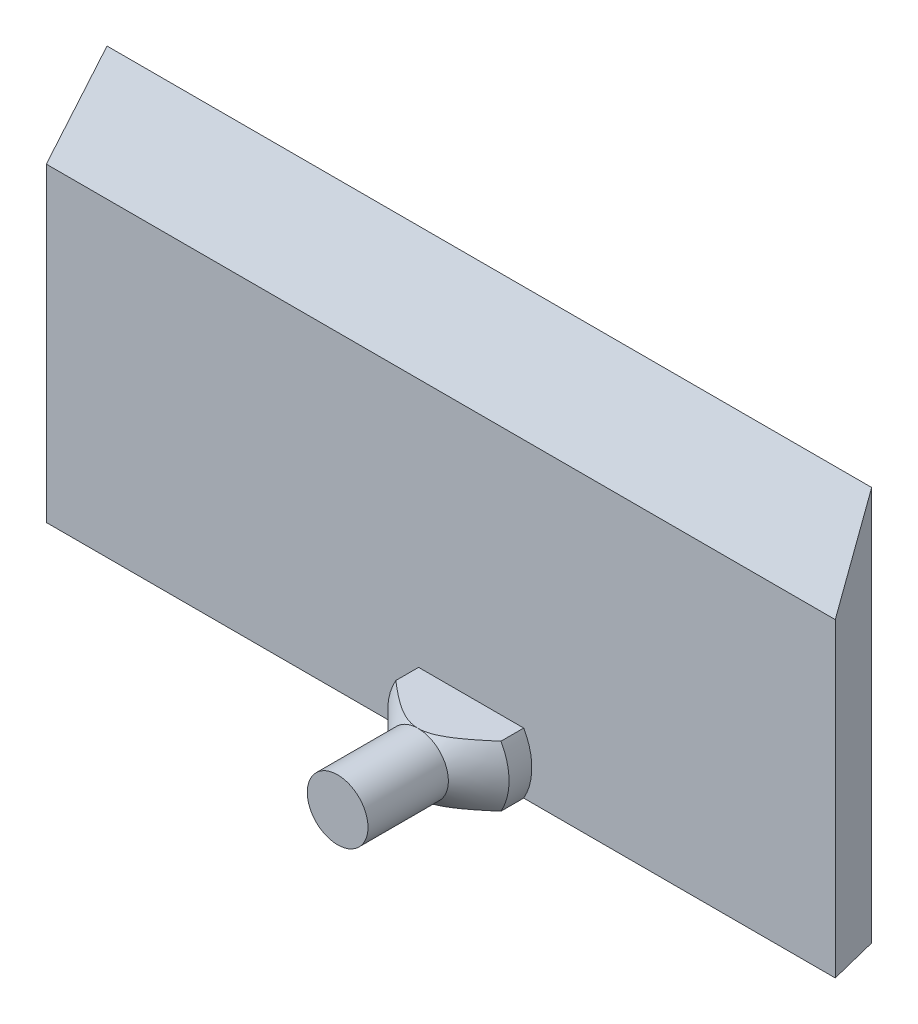
ISO-10303-21;
HEADER;
FILE_DESCRIPTION(('STEP AP214'),'2;1');
FILE_NAME('part.step','',(''),(''),'','','');
FILE_SCHEMA(('AUTOMOTIVE_DESIGN { 1 0 10303 214 1 1 1 1 }'));
ENDSEC;
DATA;
#1=APPLICATION_CONTEXT('core data for automotive mechanical design processes');
#2=APPLICATION_PROTOCOL_DEFINITION('international standard','automotive_design',2000,#1);
#3=PRODUCT_CONTEXT('',#1,'mechanical');
#4=PRODUCT('Part','Part','',(#3));
#5=PRODUCT_RELATED_PRODUCT_CATEGORY('part','',(#4));
#6=PRODUCT_DEFINITION_FORMATION('','',#4);
#7=PRODUCT_DEFINITION_CONTEXT('part definition',#1,'design');
#8=PRODUCT_DEFINITION('design','',#6,#7);
#9=PRODUCT_DEFINITION_SHAPE('','',#8);
#10=(LENGTH_UNIT() NAMED_UNIT(*) SI_UNIT(.MILLI.,.METRE.));
#11=(NAMED_UNIT(*) PLANE_ANGLE_UNIT() SI_UNIT($,.RADIAN.));
#12=(NAMED_UNIT(*) SI_UNIT($,.STERADIAN.) SOLID_ANGLE_UNIT());
#13=UNCERTAINTY_MEASURE_WITH_UNIT(LENGTH_MEASURE(1.E-05),#10,'distance_accuracy_value','');
#14=(GEOMETRIC_REPRESENTATION_CONTEXT(3) GLOBAL_UNCERTAINTY_ASSIGNED_CONTEXT((#13)) GLOBAL_UNIT_ASSIGNED_CONTEXT((#10,
#11,#12)) REPRESENTATION_CONTEXT('',''));
#15=CARTESIAN_POINT('',(0.,0.,0.));
#16=DIRECTION('',(0.,0.,1.));
#17=DIRECTION('',(1.,0.,0.));
#18=AXIS2_PLACEMENT_3D('',#15,#16,#17);
#19=CARTESIAN_POINT('',(0.,0.,1.6));
#20=DIRECTION('',(0.,0.,1.));
#21=DIRECTION('',(1.,0.,0.));
#22=AXIS2_PLACEMENT_3D('',#19,#20,#21);
#23=PLANE('',#22);
#24=DIRECTION('',(0.,-1.,0.));
#25=VECTOR('',#24,1.);
#26=CARTESIAN_POINT('',(13.,0.,1.6));
#27=LINE('',#26,#25);
#28=CARTESIAN_POINT('',(13.,3.7287187078898,1.6));
#29=VERTEX_POINT('',#28);
#30=CARTESIAN_POINT('',(13.,-6.5,1.6));
#31=VERTEX_POINT('',#30);
#32=EDGE_CURVE('E187',#29,#31,#27,.T.);
#33=ORIENTED_EDGE('',*,*,#32,.F.);
#34=DIRECTION('',(-1.,0.,0.));
#35=VECTOR('',#34,1.);
#36=CARTESIAN_POINT('',(0.,3.7287187078898,1.6));
#37=LINE('',#36,#35);
#38=CARTESIAN_POINT('',(-13.,3.7287187078898,1.6));
#39=VERTEX_POINT('',#38);
#40=EDGE_CURVE('E67',#29,#39,#37,.T.);
#41=ORIENTED_EDGE('',*,*,#40,.T.);
#42=DIRECTION('',(0.,-1.,0.));
#43=VECTOR('',#42,1.);
#44=CARTESIAN_POINT('',(-13.,0.,1.6));
#45=LINE('',#44,#43);
#46=CARTESIAN_POINT('',(-13.,-6.5,1.6));
#47=VERTEX_POINT('',#46);
#48=EDGE_CURVE('E180',#39,#47,#45,.T.);
#49=ORIENTED_EDGE('',*,*,#48,.T.);
#50=DIRECTION('',(1.,0.,0.));
#51=VECTOR('',#50,1.);
#52=CARTESIAN_POINT('',(0.,-6.5,1.6));
#53=LINE('',#52,#51);
#54=CARTESIAN_POINT('',(-0.732050807568877,-6.5,1.6));
#55=VERTEX_POINT('',#54);
#56=EDGE_CURVE('E184',#47,#55,#53,.T.);
#57=ORIENTED_EDGE('',*,*,#56,.T.);
#58=CARTESIAN_POINT('',(1.,-5.5,1.6));
#59=DIRECTION('',(0.,0.,1.));
#60=DIRECTION('',(1.,0.,0.));
#61=AXIS2_PLACEMENT_3D('',#58,#59,#60);
#62=CIRCLE('',#61,2.);
#63=CARTESIAN_POINT('',(-0.732050807568877,-4.5,1.6));
#64=VERTEX_POINT('',#63);
#65=EDGE_CURVE('E173',#55,#64,#62,.F.);
#66=ORIENTED_EDGE('',*,*,#65,.T.);
#67=DIRECTION('',(-1.,0.,0.));
#68=VECTOR('',#67,1.);
#69=CARTESIAN_POINT('',(0.,-4.5,1.6));
#70=LINE('',#69,#68);
#71=CARTESIAN_POINT('',(2.73205080756888,-4.5,1.6));
#72=VERTEX_POINT('',#71);
#73=EDGE_CURVE('E170',#72,#64,#70,.T.);
#74=ORIENTED_EDGE('',*,*,#73,.F.);
#75=CARTESIAN_POINT('',(1.,-5.5,1.6));
#76=DIRECTION('',(0.,0.,1.));
#77=DIRECTION('',(1.,0.,0.));
#78=AXIS2_PLACEMENT_3D('',#75,#76,#77);
#79=CIRCLE('',#78,2.);
#80=CARTESIAN_POINT('',(2.73205080756888,-6.5,1.6));
#81=VERTEX_POINT('',#80);
#82=EDGE_CURVE('E155',#72,#81,#79,.F.);
#83=ORIENTED_EDGE('',*,*,#82,.T.);
#84=EDGE_CURVE('E182',#81,#31,#53,.T.);
#85=ORIENTED_EDGE('',*,*,#84,.T.);
#86=EDGE_LOOP('',(#33,#41,#49,#57,#66,#74,#83,#85));
#87=FACE_BOUND('',#86,.T.);
#88=ADVANCED_FACE('F59',(#87),#23,.T.);
#89=CARTESIAN_POINT('',(1.,-5.5,6.));
#90=DIRECTION('',(0.,0.,-1.));
#91=DIRECTION('',(-1.,0.,0.));
#92=AXIS2_PLACEMENT_3D('',#89,#90,#91);
#93=CYLINDRICAL_SURFACE('',#92,1.);
#94=CARTESIAN_POINT('',(1.,-5.5,6.));
#95=DIRECTION('',(0.,0.,1.));
#96=DIRECTION('',(1.,0.,0.));
#97=AXIS2_PLACEMENT_3D('',#94,#95,#96);
#98=CIRCLE('',#97,1.);
#99=CARTESIAN_POINT('',(2.,-5.5,6.));
#100=VERTEX_POINT('',#99);
#101=EDGE_CURVE('E176',#100,#100,#98,.T.);
#102=ORIENTED_EDGE('',*,*,#101,.F.);
#103=EDGE_LOOP('',(#102));
#104=FACE_BOUND('',#103,.T.);
#105=CARTESIAN_POINT('',(1.,-5.5,3.35));
#106=DIRECTION('',(0.,0.,1.));
#107=DIRECTION('',(1.,0.,0.));
#108=AXIS2_PLACEMENT_3D('',#105,#106,#107);
#109=CIRCLE('',#108,1.);
#110=CARTESIAN_POINT('',(1.,-4.5,3.35));
#111=VERTEX_POINT('',#110);
#112=CARTESIAN_POINT('',(1.,-6.5,3.35));
#113=VERTEX_POINT('',#112);
#114=EDGE_CURVE('E133',#111,#113,#109,.T.);
#115=ORIENTED_EDGE('',*,*,#114,.T.);
#116=CARTESIAN_POINT('',(1.,-5.5,3.35));
#117=DIRECTION('',(0.,0.,1.));
#118=DIRECTION('',(1.,0.,0.));
#119=AXIS2_PLACEMENT_3D('',#116,#117,#118);
#120=CIRCLE('',#119,1.);
#121=EDGE_CURVE('E153',#113,#111,#120,.T.);
#122=ORIENTED_EDGE('',*,*,#121,.T.);
#123=EDGE_LOOP('',(#115,#122));
#124=FACE_BOUND('',#123,.T.);
#125=ADVANCED_FACE('F152',(#104,#124),#93,.T.);
#126=CARTESIAN_POINT('',(0.,-6.5,1.6));
#127=DIRECTION('',(0.,1.,0.));
#128=DIRECTION('',(0.,0.,1.));
#129=AXIS2_PLACEMENT_3D('',#126,#127,#128);
#130=PLANE('',#129);
#131=ORIENTED_EDGE('',*,*,#56,.F.);
#132=DIRECTION('',(-0.24253562503633,0.,0.970142500145333));
#133=VECTOR('',#132,1.);
#134=CARTESIAN_POINT('',(-13.,-6.5,1.60000000000002));
#135=LINE('',#134,#133);
#136=CARTESIAN_POINT('',(-12.6,-6.5,0.));
#137=VERTEX_POINT('',#136);
#138=EDGE_CURVE('E259',#47,#137,#135,.F.);
#139=ORIENTED_EDGE('',*,*,#138,.T.);
#140=DIRECTION('',(1.,0.,0.));
#141=VECTOR('',#140,1.);
#142=CARTESIAN_POINT('',(0.,-6.5,0.));
#143=LINE('',#142,#141);
#144=CARTESIAN_POINT('',(12.6,-6.5,0.));
#145=VERTEX_POINT('',#144);
#146=EDGE_CURVE('E179',#137,#145,#143,.T.);
#147=ORIENTED_EDGE('',*,*,#146,.T.);
#148=DIRECTION('',(0.242535625036331,0.,0.970142500145333));
#149=VECTOR('',#148,1.);
#150=CARTESIAN_POINT('',(12.6,-6.5,0.));
#151=LINE('',#150,#149);
#152=EDGE_CURVE('E254',#145,#31,#151,.T.);
#153=ORIENTED_EDGE('',*,*,#152,.T.);
#154=ORIENTED_EDGE('',*,*,#84,.F.);
#155=DIRECTION('',(0.,0.,-1.));
#156=VECTOR('',#155,1.);
#157=CARTESIAN_POINT('',(2.73205080756888,-6.5,3.35));
#158=LINE('',#157,#156);
#159=CARTESIAN_POINT('',(2.73205080756888,-6.5,2.35));
#160=VERTEX_POINT('',#159);
#161=EDGE_CURVE('E145',#160,#81,#158,.T.);
#162=ORIENTED_EDGE('',*,*,#161,.F.);
#163=CARTESIAN_POINT('',(2.73205080756888,-6.5,2.35));
#164=CARTESIAN_POINT('',(2.67054481449225,-6.5,2.40322594475082));
#165=CARTESIAN_POINT('',(2.6087184379048,-6.5,2.45609565517426));
#166=CARTESIAN_POINT('',(2.48407735756272,-6.5,2.56078260528335));
#167=CARTESIAN_POINT('',(2.42126172746622,-6.5,2.61259873984141));
#168=CARTESIAN_POINT('',(2.29213038069255,-6.5,2.71657118390202));
#169=CARTESIAN_POINT('',(2.2257701157202,-6.5,2.76867243456829));
#170=CARTESIAN_POINT('',(2.09126922950765,-6.5,2.87049902730658));
#171=CARTESIAN_POINT('',(2.02312934255245,-6.5,2.92022532607316));
#172=CARTESIAN_POINT('',(1.91314232878485,-6.5,2.99612591303554));
#173=CARTESIAN_POINT('',(1.87212905664819,-6.5,3.02350434174497));
#174=CARTESIAN_POINT('',(1.78904158645155,-6.5,3.07659413969861));
#175=CARTESIAN_POINT('',(1.74696763459409,-6.5,3.10230589094877));
#176=CARTESIAN_POINT('',(1.66213783926903,-6.5,3.15115001901666));
#177=CARTESIAN_POINT('',(1.61940039987545,-6.5,3.17431407129105));
#178=CARTESIAN_POINT('',(1.53244059795717,-6.5,3.21771329434738));
#179=CARTESIAN_POINT('',(1.48821837411009,-6.5,3.23794873772661));
#180=CARTESIAN_POINT('',(1.40835011398683,-6.5,3.27030622945013));
#181=CARTESIAN_POINT('',(1.37303102121739,-6.5,3.28322776893601));
#182=CARTESIAN_POINT('',(1.30146851901669,-6.5,3.30609707117669));
#183=CARTESIAN_POINT('',(1.26522614053601,-6.5,3.31604800548314));
#184=CARTESIAN_POINT('',(1.19115589569533,-6.5,3.33254163022491));
#185=CARTESIAN_POINT('',(1.15331072242542,-6.5,3.33900867350355));
#186=CARTESIAN_POINT('',(1.0769937004239,-6.5,3.3477750296311));
#187=CARTESIAN_POINT('',(1.03851994155336,-6.5,3.35005745098546));
#188=CARTESIAN_POINT('',(1.,-6.5,3.35000000000001));
#189=B_SPLINE_CURVE_WITH_KNOTS('',3,(#163,#164,#165,#166,#167,#168,#169,#170,#171,#172,#173,
#174,#175,#176,#177,#178,#179,#180,#181,#182,#183,#184,#185,#186,#187,#188),.UNSPECIFIED.,.F.,
.F.,(4,2,2,2,2,2,2,2,2,2,2,2,4),(0.,0.24402891816542,0.488301820398571,0.741379448923859,
0.99435425593846,1.14226133867834,1.29013440005459,1.43588901019085,1.58163004463185,
1.69435119103513,1.80695155729431,1.92190727897991,2.03732601370849),.UNSPECIFIED.);
#190=EDGE_CURVE('E137',#160,#113,#189,.T.);
#191=ORIENTED_EDGE('',*,*,#190,.T.);
#192=CARTESIAN_POINT('',(1.,-6.50000000000001,3.35));
#193=CARTESIAN_POINT('',(0.969217583026458,-6.5,3.35002588286225));
#194=CARTESIAN_POINT('',(0.93845116866056,-6.5,3.34857927512964));
#195=CARTESIAN_POINT('',(0.877231885289802,-6.5,3.34294551348332));
#196=CARTESIAN_POINT('',(0.846778499020305,-6.5,3.33876403953603));
#197=CARTESIAN_POINT('',(0.786902080846843,-6.5,3.32796524737564));
#198=CARTESIAN_POINT('',(0.757470428438944,-6.5,3.32139489074221));
#199=CARTESIAN_POINT('',(0.699163566600866,-6.5,3.30610743369612));
#200=CARTESIAN_POINT('',(0.670288632859421,-6.5,3.29738929771689));
#201=CARTESIAN_POINT('',(0.579220083048549,-6.5,3.26667776207806));
#202=CARTESIAN_POINT('',(0.51819453213864,-6.5,3.24121725762883));
#203=CARTESIAN_POINT('',(0.398922774025625,-6.5,3.18444000465111));
#204=CARTESIAN_POINT('',(0.340682031359657,-6.5,3.1531122910392));
#205=CARTESIAN_POINT('',(0.225274280673672,-6.5,3.08589592302184));
#206=CARTESIAN_POINT('',(0.168155821554796,-6.5,3.0499250134427));
#207=CARTESIAN_POINT('',(0.0557856693810633,-6.5,2.97530699294065));
#208=CARTESIAN_POINT('',(0.000532538150424364,-6.5,2.9366620172482));
#209=CARTESIAN_POINT('',(-0.113967965872654,-6.5,2.85359645545089));
#210=CARTESIAN_POINT('',(-0.173073548470146,-6.5,2.80898168685811));
#211=CARTESIAN_POINT('',(-0.290065163022396,-6.5,2.71815646455935));
#212=CARTESIAN_POINT('',(-0.347950830999703,-6.5,2.671945545177));
#213=CARTESIAN_POINT('',(-0.460575989727622,-6.5,2.58018242501448));
#214=CARTESIAN_POINT('',(-0.515350797691632,-6.5,2.5346733808833));
#215=CARTESIAN_POINT('',(-0.624184227941556,-6.5,2.44287042312049));
#216=CARTESIAN_POINT('',(-0.678243254767215,-6.5,2.39657698976466));
#217=CARTESIAN_POINT('',(-0.732050807568877,-6.5,2.35));
#218=B_SPLINE_CURVE_WITH_KNOTS('',3,(#192,#193,#194,#195,#196,#197,#198,#199,#200,#201,#202,
#203,#204,#205,#206,#207,#208,#209,#210,#211,#212,#213,#214,#215,#216,#217),.UNSPECIFIED.,.F.,
.F.,(4,2,2,2,2,2,2,2,2,2,2,2,4),(0.,0.0922876668811465,0.184384270158992,0.274760476369463,
0.365180343666278,0.563014388829108,0.761221918900095,0.963609592341157,1.16583748453077,
1.38795965621851,1.61014718861804,1.82377887821359,2.03728417839405),.UNSPECIFIED.);
#219=CARTESIAN_POINT('',(-0.732050807568877,-6.5,2.35));
#220=VERTEX_POINT('',#219);
#221=EDGE_CURVE('E128',#113,#220,#218,.T.);
#222=ORIENTED_EDGE('',*,*,#221,.T.);
#223=DIRECTION('',(0.,0.,-1.));
#224=VECTOR('',#223,1.);
#225=CARTESIAN_POINT('',(-0.732050807568877,-6.5,3.35));
#226=LINE('',#225,#224);
#227=EDGE_CURVE('E154',#220,#55,#226,.T.);
#228=ORIENTED_EDGE('',*,*,#227,.T.);
#229=EDGE_LOOP('',(#131,#139,#147,#153,#154,#162,#191,#222,#228));
#230=FACE_BOUND('',#229,.T.);
#231=ADVANCED_FACE('F143',(#230),#130,.F.);
#232=CARTESIAN_POINT('',(0.,0.,0.));
#233=DIRECTION('',(0.,0.,1.));
#234=DIRECTION('',(1.,0.,0.));
#235=AXIS2_PLACEMENT_3D('',#232,#233,#234);
#236=PLANE('',#235);
#237=ORIENTED_EDGE('',*,*,#146,.F.);
#238=DIRECTION('',(0.,1.,0.));
#239=VECTOR('',#238,1.);
#240=CARTESIAN_POINT('',(-12.6,0.,0.));
#241=LINE('',#240,#239);
#242=CARTESIAN_POINT('',(-12.6,6.5,0.));
#243=VERTEX_POINT('',#242);
#244=EDGE_CURVE('E261',#137,#243,#241,.T.);
#245=ORIENTED_EDGE('',*,*,#244,.T.);
#246=DIRECTION('',(1.,0.,0.));
#247=VECTOR('',#246,1.);
#248=CARTESIAN_POINT('',(0.,6.5,0.));
#249=LINE('',#248,#247);
#250=CARTESIAN_POINT('',(12.6,6.5,0.));
#251=VERTEX_POINT('',#250);
#252=EDGE_CURVE('E183',#243,#251,#249,.T.);
#253=ORIENTED_EDGE('',*,*,#252,.T.);
#254=DIRECTION('',(0.,-1.,0.));
#255=VECTOR('',#254,1.);
#256=CARTESIAN_POINT('',(12.6,-6.5,0.));
#257=LINE('',#256,#255);
#258=EDGE_CURVE('E252',#251,#145,#257,.T.);
#259=ORIENTED_EDGE('',*,*,#258,.T.);
#260=EDGE_LOOP('',(#237,#245,#253,#259));
#261=FACE_BOUND('',#260,.T.);
#262=ADVANCED_FACE('F225',(#261),#236,.F.);
#263=CARTESIAN_POINT('',(0.,0.,6.));
#264=DIRECTION('',(0.,0.,1.));
#265=DIRECTION('',(1.,0.,0.));
#266=AXIS2_PLACEMENT_3D('',#263,#264,#265);
#267=PLANE('',#266);
#268=ORIENTED_EDGE('',*,*,#101,.T.);
#269=EDGE_LOOP('',(#268));
#270=FACE_BOUND('',#269,.T.);
#271=ADVANCED_FACE('F229',(#270),#267,.T.);
#272=CARTESIAN_POINT('',(0.,-4.5,3.35));
#273=DIRECTION('',(0.,1.,0.));
#274=DIRECTION('',(0.,0.,1.));
#275=AXIS2_PLACEMENT_3D('',#272,#273,#274);
#276=PLANE('',#275);
#277=CARTESIAN_POINT('',(-0.732050807568877,-4.5,2.35));
#278=CARTESIAN_POINT('',(-0.670544814492248,-4.5,2.40322594475082));
#279=CARTESIAN_POINT('',(-0.6087184379048,-4.5,2.45609565517426));
#280=CARTESIAN_POINT('',(-0.484077357562721,-4.5,2.56078260528335));
#281=CARTESIAN_POINT('',(-0.421261727466223,-4.5,2.61259873984141));
#282=CARTESIAN_POINT('',(-0.292130380692552,-4.5,2.71657118390202));
#283=CARTESIAN_POINT('',(-0.225770115720197,-4.5,2.76867243456829));
#284=CARTESIAN_POINT('',(-0.0912692295076441,-4.5,2.87049902730658));
#285=CARTESIAN_POINT('',(-0.0231293425524469,-4.5,2.92022532607316));
#286=CARTESIAN_POINT('',(0.0868576712151564,-4.5,2.99612591303554));
#287=CARTESIAN_POINT('',(0.12787094335181,-4.5,3.02350434174497));
#288=CARTESIAN_POINT('',(0.210958413548451,-4.5,3.07659413969861));
#289=CARTESIAN_POINT('',(0.253032365405911,-4.5,3.10230589094877));
#290=CARTESIAN_POINT('',(0.337862160730977,-4.5,3.15115001901666));
#291=CARTESIAN_POINT('',(0.380599600124557,-4.5,3.17431407129105));
#292=CARTESIAN_POINT('',(0.467559402042836,-4.5,3.21771329434738));
#293=CARTESIAN_POINT('',(0.511781625889909,-4.5,3.23794873772661));
#294=CARTESIAN_POINT('',(0.591649886013167,-4.5,3.27030622945013));
#295=CARTESIAN_POINT('',(0.62696897878261,-4.5,3.28322776893601));
#296=CARTESIAN_POINT('',(0.698531480983313,-4.5,3.30609707117669));
#297=CARTESIAN_POINT('',(0.734773859463994,-4.5,3.31604800548314));
#298=CARTESIAN_POINT('',(0.808844104304677,-4.5,3.33254163022491));
#299=CARTESIAN_POINT('',(0.846689277574579,-4.5,3.33900867350355));
#300=CARTESIAN_POINT('',(0.923006299576102,-4.5,3.3477750296311));
#301=CARTESIAN_POINT('',(0.961480058446647,-4.5,3.35005745098546));
#302=CARTESIAN_POINT('',(0.999999999999998,-4.5,3.35000000000001));
#303=B_SPLINE_CURVE_WITH_KNOTS('',3,(#277,#278,#279,#280,#281,#282,#283,#284,#285,#286,#287,
#288,#289,#290,#291,#292,#293,#294,#295,#296,#297,#298,#299,#300,#301,#302),.UNSPECIFIED.,.F.,
.F.,(4,2,2,2,2,2,2,2,2,2,2,2,4),(0.,0.244028918165421,0.488301820398571,0.741379448923859,
0.99435425593846,1.14226133867834,1.29013440005459,1.43588901019085,1.58163004463185,
1.69435119103513,1.80695155729431,1.92190727897991,2.03732601370849),.UNSPECIFIED.);
#304=CARTESIAN_POINT('',(-0.732050807568877,-4.5,2.35));
#305=VERTEX_POINT('',#304);
#306=EDGE_CURVE('E189',#305,#111,#303,.T.);
#307=ORIENTED_EDGE('',*,*,#306,.T.);
#308=CARTESIAN_POINT('',(1.,-4.49999999999999,3.35));
#309=CARTESIAN_POINT('',(1.03078241697354,-4.5,3.35002588286225));
#310=CARTESIAN_POINT('',(1.06154883133944,-4.5,3.34857927512964));
#311=CARTESIAN_POINT('',(1.1227681147102,-4.5,3.34294551348332));
#312=CARTESIAN_POINT('',(1.1532215009797,-4.5,3.33876403953603));
#313=CARTESIAN_POINT('',(1.21309791915316,-4.5,3.32796524737564));
#314=CARTESIAN_POINT('',(1.24252957156106,-4.5,3.32139489074221));
#315=CARTESIAN_POINT('',(1.30083643339914,-4.5,3.30610743369612));
#316=CARTESIAN_POINT('',(1.32971136714058,-4.5,3.29738929771689));
#317=CARTESIAN_POINT('',(1.42077991695145,-4.5,3.26667776207806));
#318=CARTESIAN_POINT('',(1.48180546786136,-4.5,3.24121725762883));
#319=CARTESIAN_POINT('',(1.60107722597438,-4.5,3.18444000465111));
#320=CARTESIAN_POINT('',(1.65931796864034,-4.5,3.1531122910392));
#321=CARTESIAN_POINT('',(1.77472571932633,-4.5,3.08589592302184));
#322=CARTESIAN_POINT('',(1.83184417844521,-4.5,3.0499250134427));
#323=CARTESIAN_POINT('',(1.94421433061894,-4.5,2.97530699294065));
#324=CARTESIAN_POINT('',(1.99946746184958,-4.5,2.9366620172482));
#325=CARTESIAN_POINT('',(2.11396796587266,-4.5,2.85359645545089));
#326=CARTESIAN_POINT('',(2.17307354847015,-4.5,2.8089816868581));
#327=CARTESIAN_POINT('',(2.2900651630224,-4.5,2.71815646455935));
#328=CARTESIAN_POINT('',(2.3479508309997,-4.5,2.671945545177));
#329=CARTESIAN_POINT('',(2.46057598972762,-4.5,2.58018242501448));
#330=CARTESIAN_POINT('',(2.51535079769163,-4.5,2.5346733808833));
#331=CARTESIAN_POINT('',(2.62418422794156,-4.5,2.44287042312049));
#332=CARTESIAN_POINT('',(2.67824325476722,-4.5,2.39657698976466));
#333=CARTESIAN_POINT('',(2.73205080756888,-4.5,2.35));
#334=B_SPLINE_CURVE_WITH_KNOTS('',3,(#308,#309,#310,#311,#312,#313,#314,#315,#316,#317,#318,
#319,#320,#321,#322,#323,#324,#325,#326,#327,#328,#329,#330,#331,#332,#333),.UNSPECIFIED.,.F.,
.F.,(4,2,2,2,2,2,2,2,2,2,2,2,4),(0.,0.0922876668811466,0.184384270158992,0.274760476369463,
0.365180343666278,0.563014388829107,0.761221918900095,0.963609592341156,1.16583748453077,
1.38795965621851,1.61014718861804,1.82377887821359,2.03728417839405),.UNSPECIFIED.);
#335=CARTESIAN_POINT('',(2.73205080756888,-4.5,2.35));
#336=VERTEX_POINT('',#335);
#337=EDGE_CURVE('E158',#111,#336,#334,.T.);
#338=ORIENTED_EDGE('',*,*,#337,.T.);
#339=DIRECTION('',(0.,0.,-1.));
#340=VECTOR('',#339,1.);
#341=CARTESIAN_POINT('',(2.73205080756888,-4.5,3.35));
#342=LINE('',#341,#340);
#343=EDGE_CURVE('E160',#336,#72,#342,.T.);
#344=ORIENTED_EDGE('',*,*,#343,.T.);
#345=ORIENTED_EDGE('',*,*,#73,.T.);
#346=DIRECTION('',(0.,0.,-1.));
#347=VECTOR('',#346,1.);
#348=CARTESIAN_POINT('',(-0.732050807568877,-4.5,3.35));
#349=LINE('',#348,#347);
#350=EDGE_CURVE('E168',#305,#64,#349,.T.);
#351=ORIENTED_EDGE('',*,*,#350,.F.);
#352=EDGE_LOOP('',(#307,#338,#344,#345,#351));
#353=FACE_BOUND('',#352,.T.);
#354=ADVANCED_FACE('F204',(#353),#276,.T.);
#355=CARTESIAN_POINT('',(1.,-5.5,3.35));
#356=DIRECTION('',(0.,0.,-1.));
#357=DIRECTION('',(-1.,0.,0.));
#358=AXIS2_PLACEMENT_3D('',#355,#356,#357);
#359=CYLINDRICAL_SURFACE('',#358,2.);
#360=ORIENTED_EDGE('',*,*,#227,.F.);
#361=CARTESIAN_POINT('',(1.,-5.5,2.35));
#362=DIRECTION('',(0.,0.,1.));
#363=DIRECTION('',(1.,0.,0.));
#364=AXIS2_PLACEMENT_3D('',#361,#362,#363);
#365=CIRCLE('',#364,2.);
#366=EDGE_CURVE('E134',#220,#305,#365,.F.);
#367=ORIENTED_EDGE('',*,*,#366,.T.);
#368=ORIENTED_EDGE('',*,*,#350,.T.);
#369=ORIENTED_EDGE('',*,*,#65,.F.);
#370=EDGE_LOOP('',(#360,#367,#368,#369));
#371=FACE_BOUND('',#370,.T.);
#372=ADVANCED_FACE('F240',(#371),#359,.T.);
#373=CARTESIAN_POINT('',(1.,-5.5,3.35));
#374=DIRECTION('',(0.,0.,-1.));
#375=DIRECTION('',(-1.,0.,0.));
#376=AXIS2_PLACEMENT_3D('',#373,#374,#375);
#377=CYLINDRICAL_SURFACE('',#376,2.);
#378=ORIENTED_EDGE('',*,*,#343,.F.);
#379=CARTESIAN_POINT('',(1.,-5.5,2.35));
#380=DIRECTION('',(0.,0.,1.));
#381=DIRECTION('',(1.,0.,0.));
#382=AXIS2_PLACEMENT_3D('',#379,#380,#381);
#383=CIRCLE('',#382,2.);
#384=EDGE_CURVE('E138',#336,#160,#383,.F.);
#385=ORIENTED_EDGE('',*,*,#384,.T.);
#386=ORIENTED_EDGE('',*,*,#161,.T.);
#387=ORIENTED_EDGE('',*,*,#82,.F.);
#388=EDGE_LOOP('',(#378,#385,#386,#387));
#389=FACE_BOUND('',#388,.T.);
#390=ADVANCED_FACE('F246',(#389),#377,.T.);
#391=CARTESIAN_POINT('',(1.,-5.5,3.35));
#392=DIRECTION('',(0.,0.,-1.));
#393=DIRECTION('',(-1.,0.,0.));
#394=AXIS2_PLACEMENT_3D('',#391,#392,#393);
#395=CONICAL_SURFACE('',#394,1.00000000000001,0.785398163397447);
#396=ORIENTED_EDGE('',*,*,#190,.F.);
#397=ORIENTED_EDGE('',*,*,#384,.F.);
#398=ORIENTED_EDGE('',*,*,#337,.F.);
#399=ORIENTED_EDGE('',*,*,#121,.F.);
#400=EDGE_LOOP('',(#396,#397,#398,#399));
#401=FACE_BOUND('',#400,.T.);
#402=ADVANCED_FACE('F157',(#401),#395,.T.);
#403=CARTESIAN_POINT('',(1.,-5.5,3.35));
#404=DIRECTION('',(0.,0.,-1.));
#405=DIRECTION('',(-1.,0.,0.));
#406=AXIS2_PLACEMENT_3D('',#403,#404,#405);
#407=CONICAL_SURFACE('',#406,1.00000000000001,0.785398163397447);
#408=ORIENTED_EDGE('',*,*,#306,.F.);
#409=ORIENTED_EDGE('',*,*,#366,.F.);
#410=ORIENTED_EDGE('',*,*,#221,.F.);
#411=ORIENTED_EDGE('',*,*,#114,.F.);
#412=EDGE_LOOP('',(#408,#409,#410,#411));
#413=FACE_BOUND('',#412,.T.);
#414=ADVANCED_FACE('F131',(#413),#407,.T.);
#415=CARTESIAN_POINT('',(12.6,0.,0.));
#416=DIRECTION('',(0.970142500145332,0.,-0.24253562503633));
#417=DIRECTION('',(0.,1.,0.));
#418=AXIS2_PLACEMENT_3D('',#415,#416,#417);
#419=PLANE('',#418);
#420=ORIENTED_EDGE('',*,*,#258,.F.);
#421=DIRECTION('',(-0.124034734589207,0.85933784884732,-0.496138938356834));
#422=VECTOR('',#421,1.);
#423=CARTESIAN_POINT('',(13.2928203230275,1.7,2.7712812921102));
#424=LINE('',#423,#422);
#425=EDGE_CURVE('E81',#251,#29,#424,.F.);
#426=ORIENTED_EDGE('',*,*,#425,.T.);
#427=ORIENTED_EDGE('',*,*,#32,.T.);
#428=ORIENTED_EDGE('',*,*,#152,.F.);
#429=EDGE_LOOP('',(#420,#426,#427,#428));
#430=FACE_BOUND('',#429,.T.);
#431=ADVANCED_FACE('F211',(#430),#419,.T.);
#432=CARTESIAN_POINT('',(-13.,0.,1.60000000000002));
#433=DIRECTION('',(0.970142500145333,0.,0.24253562503633));
#434=DIRECTION('',(0.,-1.,0.));
#435=AXIS2_PLACEMENT_3D('',#432,#433,#434);
#436=PLANE('',#435);
#437=ORIENTED_EDGE('',*,*,#48,.F.);
#438=DIRECTION('',(0.124034734589206,0.85933784884732,-0.496138938356834));
#439=VECTOR('',#438,1.);
#440=CARTESIAN_POINT('',(-13.3974357076429,0.975203354371166,3.18974283057175));
#441=LINE('',#440,#439);
#442=EDGE_CURVE('E12',#39,#243,#441,.T.);
#443=ORIENTED_EDGE('',*,*,#442,.T.);
#444=ORIENTED_EDGE('',*,*,#244,.F.);
#445=ORIENTED_EDGE('',*,*,#138,.F.);
#446=EDGE_LOOP('',(#437,#443,#444,#445));
#447=FACE_BOUND('',#446,.T.);
#448=ADVANCED_FACE('F271',(#447),#436,.F.);
#449=CARTESIAN_POINT('',(0.,6.5,0.));
#450=DIRECTION('',(0.,-0.5,-0.866025403784438));
#451=DIRECTION('',(1.,0.,0.));
#452=AXIS2_PLACEMENT_3D('',#449,#450,#451);
#453=PLANE('',#452);
#454=ORIENTED_EDGE('',*,*,#442,.F.);
#455=ORIENTED_EDGE('',*,*,#40,.F.);
#456=ORIENTED_EDGE('',*,*,#425,.F.);
#457=ORIENTED_EDGE('',*,*,#252,.F.);
#458=EDGE_LOOP('',(#454,#455,#456,#457));
#459=FACE_BOUND('',#458,.T.);
#460=ADVANCED_FACE('F61',(#459),#453,.F.);
#461=CLOSED_SHELL('',(#88,#125,#231,#262,#271,#354,#372,#390,#402,#414,#431,#448,#460));
#462=MANIFOLD_SOLID_BREP('B2',#461);
#463=ADVANCED_BREP_SHAPE_REPRESENTATION('',(#18,#462),#14);
#464=SHAPE_DEFINITION_REPRESENTATION(#9,#463);
ENDSEC;
END-ISO-10303-21;
